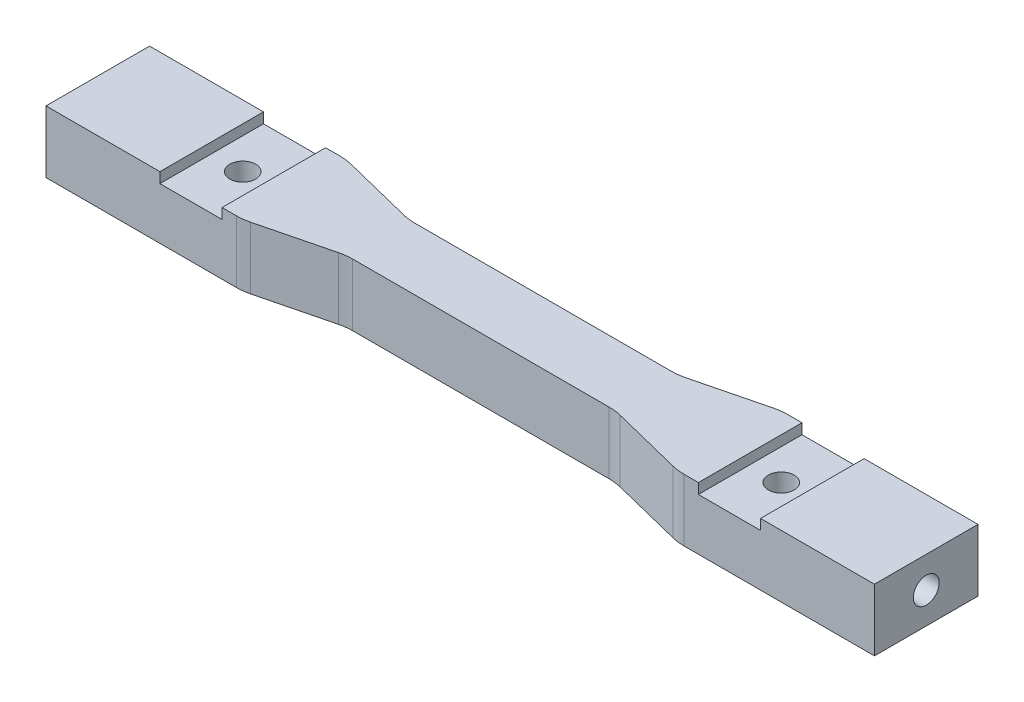
ISO-10303-21;
HEADER;
FILE_DESCRIPTION(('STEP AP214'),'2;1');
FILE_NAME('part.step','',(''),(''),'','','');
FILE_SCHEMA(('AUTOMOTIVE_DESIGN { 1 0 10303 214 1 1 1 1 }'));
ENDSEC;
DATA;
#1=APPLICATION_CONTEXT('core data for automotive mechanical design processes');
#2=APPLICATION_PROTOCOL_DEFINITION('international standard','automotive_design',2000,#1);
#3=PRODUCT_CONTEXT('',#1,'mechanical');
#4=PRODUCT('Part','Part','',(#3));
#5=PRODUCT_RELATED_PRODUCT_CATEGORY('part','',(#4));
#6=PRODUCT_DEFINITION_FORMATION('','',#4);
#7=PRODUCT_DEFINITION_CONTEXT('part definition',#1,'design');
#8=PRODUCT_DEFINITION('design','',#6,#7);
#9=PRODUCT_DEFINITION_SHAPE('','',#8);
#10=(LENGTH_UNIT() NAMED_UNIT(*) SI_UNIT(.MILLI.,.METRE.));
#11=(NAMED_UNIT(*) PLANE_ANGLE_UNIT() SI_UNIT($,.RADIAN.));
#12=(NAMED_UNIT(*) SI_UNIT($,.STERADIAN.) SOLID_ANGLE_UNIT());
#13=UNCERTAINTY_MEASURE_WITH_UNIT(LENGTH_MEASURE(1.E-05),#10,'distance_accuracy_value','');
#14=(GEOMETRIC_REPRESENTATION_CONTEXT(3) GLOBAL_UNCERTAINTY_ASSIGNED_CONTEXT((#13)) GLOBAL_UNIT_ASSIGNED_CONTEXT((#10,
#11,#12)) REPRESENTATION_CONTEXT('',''));
#15=CARTESIAN_POINT('',(0.,0.,0.));
#16=DIRECTION('',(0.,0.,1.));
#17=DIRECTION('',(1.,0.,0.));
#18=AXIS2_PLACEMENT_3D('',#15,#16,#17);
#19=CARTESIAN_POINT('',(0.,6.,0.));
#20=DIRECTION('',(0.,0.,-1.));
#21=DIRECTION('',(-1.,0.,0.));
#22=AXIS2_PLACEMENT_3D('',#19,#20,#21);
#23=PLANE('',#22);
#24=DIRECTION('',(1.,0.,0.));
#25=VECTOR('',#24,1.);
#26=CARTESIAN_POINT('',(0.,0.,0.));
#27=LINE('',#26,#25);
#28=CARTESIAN_POINT('',(0.,0.,0.));
#29=VERTEX_POINT('',#28);
#30=CARTESIAN_POINT('',(18.3844718719117,0.,0.));
#31=VERTEX_POINT('',#30);
#32=EDGE_CURVE('E329',#29,#31,#27,.T.);
#33=ORIENTED_EDGE('',*,*,#32,.T.);
#34=DIRECTION('',(0.,1.,0.));
#35=VECTOR('',#34,1.);
#36=CARTESIAN_POINT('',(18.3844718719117,6.,0.));
#37=LINE('',#36,#35);
#38=CARTESIAN_POINT('',(18.3844718719117,6.,0.));
#39=VERTEX_POINT('',#38);
#40=EDGE_CURVE('E394',#31,#39,#37,.T.);
#41=ORIENTED_EDGE('',*,*,#40,.T.);
#42=DIRECTION('',(1.,0.,0.));
#43=VECTOR('',#42,1.);
#44=CARTESIAN_POINT('',(0.,6.,0.));
#45=LINE('',#44,#43);
#46=CARTESIAN_POINT('',(17.,6.,0.));
#47=VERTEX_POINT('',#46);
#48=EDGE_CURVE('E316',#47,#39,#45,.T.);
#49=ORIENTED_EDGE('',*,*,#48,.F.);
#50=DIRECTION('',(0.,1.,0.));
#51=VECTOR('',#50,1.);
#52=CARTESIAN_POINT('',(17.,5.,0.));
#53=LINE('',#52,#51);
#54=CARTESIAN_POINT('',(17.,5.,0.));
#55=VERTEX_POINT('',#54);
#56=EDGE_CURVE('E303',#55,#47,#53,.T.);
#57=ORIENTED_EDGE('',*,*,#56,.F.);
#58=DIRECTION('',(1.,0.,0.));
#59=VECTOR('',#58,1.);
#60=CARTESIAN_POINT('',(11.,5.,0.));
#61=LINE('',#60,#59);
#62=CARTESIAN_POINT('',(11.,5.,0.));
#63=VERTEX_POINT('',#62);
#64=EDGE_CURVE('E283',#63,#55,#61,.T.);
#65=ORIENTED_EDGE('',*,*,#64,.F.);
#66=DIRECTION('',(0.,1.,0.));
#67=VECTOR('',#66,1.);
#68=CARTESIAN_POINT('',(11.,5.,0.));
#69=LINE('',#68,#67);
#70=CARTESIAN_POINT('',(11.,6.,0.));
#71=VERTEX_POINT('',#70);
#72=EDGE_CURVE('E293',#63,#71,#69,.T.);
#73=ORIENTED_EDGE('',*,*,#72,.T.);
#74=CARTESIAN_POINT('',(0.,6.,0.));
#75=VERTEX_POINT('',#74);
#76=EDGE_CURVE('E312',#75,#71,#45,.T.);
#77=ORIENTED_EDGE('',*,*,#76,.F.);
#78=DIRECTION('',(0.,-1.,0.));
#79=VECTOR('',#78,1.);
#80=CARTESIAN_POINT('',(0.,6.,0.));
#81=LINE('',#80,#79);
#82=EDGE_CURVE('E345',#75,#29,#81,.T.);
#83=ORIENTED_EDGE('',*,*,#82,.T.);
#84=EDGE_LOOP('',(#33,#41,#49,#57,#65,#73,#77,#83));
#85=FACE_BOUND('',#84,.T.);
#86=ADVANCED_FACE('F35',(#85),#23,.F.);
#87=CARTESIAN_POINT('',(0.,6.,-10.));
#88=DIRECTION('',(0.,0.,1.));
#89=DIRECTION('',(1.,0.,0.));
#90=AXIS2_PLACEMENT_3D('',#87,#88,#89);
#91=PLANE('',#90);
#92=DIRECTION('',(-1.,0.,0.));
#93=VECTOR('',#92,1.);
#94=CARTESIAN_POINT('',(0.,0.,-10.));
#95=LINE('',#94,#93);
#96=CARTESIAN_POINT('',(80.,0.,-10.));
#97=VERTEX_POINT('',#96);
#98=CARTESIAN_POINT('',(61.6155281280883,0.,-10.));
#99=VERTEX_POINT('',#98);
#100=EDGE_CURVE('E311',#97,#99,#95,.T.);
#101=ORIENTED_EDGE('',*,*,#100,.T.);
#102=DIRECTION('',(0.,1.,0.));
#103=VECTOR('',#102,1.);
#104=CARTESIAN_POINT('',(61.6155281280883,6.,-10.));
#105=LINE('',#104,#103);
#106=CARTESIAN_POINT('',(61.6155281280883,6.,-10.));
#107=VERTEX_POINT('',#106);
#108=EDGE_CURVE('E397',#99,#107,#105,.T.);
#109=ORIENTED_EDGE('',*,*,#108,.T.);
#110=DIRECTION('',(-1.,0.,0.));
#111=VECTOR('',#110,1.);
#112=CARTESIAN_POINT('',(0.,6.,-10.));
#113=LINE('',#112,#111);
#114=CARTESIAN_POINT('',(63.,6.,-10.));
#115=VERTEX_POINT('',#114);
#116=EDGE_CURVE('E324',#115,#107,#113,.T.);
#117=ORIENTED_EDGE('',*,*,#116,.F.);
#118=DIRECTION('',(0.,1.,0.));
#119=VECTOR('',#118,1.);
#120=CARTESIAN_POINT('',(63.,5.,-10.));
#121=LINE('',#120,#119);
#122=CARTESIAN_POINT('',(63.,5.,-10.));
#123=VERTEX_POINT('',#122);
#124=EDGE_CURVE('E276',#123,#115,#121,.T.);
#125=ORIENTED_EDGE('',*,*,#124,.F.);
#126=DIRECTION('',(-1.,0.,0.));
#127=VECTOR('',#126,1.);
#128=CARTESIAN_POINT('',(69.,5.,-10.));
#129=LINE('',#128,#127);
#130=CARTESIAN_POINT('',(69.,5.,-10.));
#131=VERTEX_POINT('',#130);
#132=EDGE_CURVE('E256',#131,#123,#129,.T.);
#133=ORIENTED_EDGE('',*,*,#132,.F.);
#134=DIRECTION('',(0.,1.,0.));
#135=VECTOR('',#134,1.);
#136=CARTESIAN_POINT('',(69.,5.,-10.));
#137=LINE('',#136,#135);
#138=CARTESIAN_POINT('',(69.,6.,-10.));
#139=VERTEX_POINT('',#138);
#140=EDGE_CURVE('E266',#131,#139,#137,.T.);
#141=ORIENTED_EDGE('',*,*,#140,.T.);
#142=CARTESIAN_POINT('',(80.,6.,-10.));
#143=VERTEX_POINT('',#142);
#144=EDGE_CURVE('E320',#143,#139,#113,.T.);
#145=ORIENTED_EDGE('',*,*,#144,.F.);
#146=DIRECTION('',(0.,-1.,0.));
#147=VECTOR('',#146,1.);
#148=CARTESIAN_POINT('',(80.,6.,-10.));
#149=LINE('',#148,#147);
#150=EDGE_CURVE('E339',#143,#97,#149,.T.);
#151=ORIENTED_EDGE('',*,*,#150,.T.);
#152=EDGE_LOOP('',(#101,#109,#117,#125,#133,#141,#145,#151));
#153=FACE_BOUND('',#152,.T.);
#154=ADVANCED_FACE('F482',(#153),#91,.F.);
#155=CARTESIAN_POINT('',(0.,6.,0.));
#156=DIRECTION('',(0.,-1.,0.));
#157=DIRECTION('',(0.,0.,-1.));
#158=AXIS2_PLACEMENT_3D('',#155,#156,#157);
#159=PLANE('',#158);
#160=ORIENTED_EDGE('',*,*,#144,.T.);
#161=DIRECTION('',(0.,0.,-1.));
#162=VECTOR('',#161,1.);
#163=CARTESIAN_POINT('',(69.,6.,-10.));
#164=LINE('',#163,#162);
#165=CARTESIAN_POINT('',(69.,6.,0.));
#166=VERTEX_POINT('',#165);
#167=EDGE_CURVE('E252',#166,#139,#164,.T.);
#168=ORIENTED_EDGE('',*,*,#167,.F.);
#169=CARTESIAN_POINT('',(80.,6.,0.));
#170=VERTEX_POINT('',#169);
#171=EDGE_CURVE('E310',#166,#170,#45,.T.);
#172=ORIENTED_EDGE('',*,*,#171,.T.);
#173=DIRECTION('',(0.,0.,-1.));
#174=VECTOR('',#173,1.);
#175=CARTESIAN_POINT('',(80.,6.,0.));
#176=LINE('',#175,#174);
#177=EDGE_CURVE('E315',#170,#143,#176,.T.);
#178=ORIENTED_EDGE('',*,*,#177,.T.);
#179=EDGE_LOOP('',(#160,#168,#172,#178));
#180=FACE_BOUND('',#179,.T.);
#181=ADVANCED_FACE('F558',(#180),#159,.F.);
#182=ORIENTED_EDGE('',*,*,#76,.T.);
#183=DIRECTION('',(0.,0.,1.));
#184=VECTOR('',#183,1.);
#185=CARTESIAN_POINT('',(11.,6.,-10.));
#186=LINE('',#185,#184);
#187=CARTESIAN_POINT('',(11.,6.,-10.));
#188=VERTEX_POINT('',#187);
#189=EDGE_CURVE('E272',#188,#71,#186,.T.);
#190=ORIENTED_EDGE('',*,*,#189,.F.);
#191=CARTESIAN_POINT('',(0.,6.,-10.));
#192=VERTEX_POINT('',#191);
#193=EDGE_CURVE('E319',#188,#192,#113,.T.);
#194=ORIENTED_EDGE('',*,*,#193,.T.);
#195=DIRECTION('',(0.,0.,1.));
#196=VECTOR('',#195,1.);
#197=CARTESIAN_POINT('',(0.,6.,0.));
#198=LINE('',#197,#196);
#199=EDGE_CURVE('E307',#192,#75,#198,.T.);
#200=ORIENTED_EDGE('',*,*,#199,.T.);
#201=EDGE_LOOP('',(#182,#190,#194,#200));
#202=FACE_BOUND('',#201,.T.);
#203=ADVANCED_FACE('F545',(#202),#159,.F.);
#204=CARTESIAN_POINT('',(0.,6.,0.));
#205=DIRECTION('',(1.,0.,0.));
#206=DIRECTION('',(0.,0.,-1.));
#207=AXIS2_PLACEMENT_3D('',#204,#205,#206);
#208=PLANE('',#207);
#209=CARTESIAN_POINT('',(0.,3.,-5.));
#210=DIRECTION('',(-1.,0.,0.));
#211=DIRECTION('',(0.,0.,1.));
#212=AXIS2_PLACEMENT_3D('',#209,#210,#211);
#213=CIRCLE('',#212,1.24999999999999);
#214=CARTESIAN_POINT('',(0.,3.,-3.75000000000001));
#215=VERTEX_POINT('',#214);
#216=EDGE_CURVE('E246',#215,#215,#213,.T.);
#217=ORIENTED_EDGE('',*,*,#216,.F.);
#218=EDGE_LOOP('',(#217));
#219=FACE_BOUND('',#218,.T.);
#220=DIRECTION('',(0.,0.,1.));
#221=VECTOR('',#220,1.);
#222=CARTESIAN_POINT('',(0.,0.,0.));
#223=LINE('',#222,#221);
#224=CARTESIAN_POINT('',(0.,0.,-10.));
#225=VERTEX_POINT('',#224);
#226=EDGE_CURVE('E299',#225,#29,#223,.T.);
#227=ORIENTED_EDGE('',*,*,#226,.T.);
#228=ORIENTED_EDGE('',*,*,#82,.F.);
#229=ORIENTED_EDGE('',*,*,#199,.F.);
#230=DIRECTION('',(0.,-1.,0.));
#231=VECTOR('',#230,1.);
#232=CARTESIAN_POINT('',(0.,6.,-10.));
#233=LINE('',#232,#231);
#234=EDGE_CURVE('E323',#192,#225,#233,.T.);
#235=ORIENTED_EDGE('',*,*,#234,.T.);
#236=EDGE_LOOP('',(#227,#228,#229,#235));
#237=FACE_BOUND('',#236,.T.);
#238=ADVANCED_FACE('F531',(#219,#237),#208,.F.);
#239=CARTESIAN_POINT('',(61.6155281280883,6.,0.));
#240=VERTEX_POINT('',#239);
#241=CARTESIAN_POINT('',(63.,6.,0.));
#242=VERTEX_POINT('',#241);
#243=EDGE_CURVE('E317',#240,#242,#45,.T.);
#244=ORIENTED_EDGE('',*,*,#243,.F.);
#245=DIRECTION('',(0.,1.,0.));
#246=VECTOR('',#245,1.);
#247=CARTESIAN_POINT('',(61.6155281280883,6.,0.));
#248=LINE('',#247,#246);
#249=CARTESIAN_POINT('',(61.6155281280883,0.,0.));
#250=VERTEX_POINT('',#249);
#251=EDGE_CURVE('E375',#240,#250,#248,.F.);
#252=ORIENTED_EDGE('',*,*,#251,.T.);
#253=CARTESIAN_POINT('',(80.,0.,0.));
#254=VERTEX_POINT('',#253);
#255=EDGE_CURVE('E328',#250,#254,#27,.T.);
#256=ORIENTED_EDGE('',*,*,#255,.T.);
#257=DIRECTION('',(0.,-1.,0.));
#258=VECTOR('',#257,1.);
#259=CARTESIAN_POINT('',(80.,6.,0.));
#260=LINE('',#259,#258);
#261=EDGE_CURVE('E342',#170,#254,#260,.T.);
#262=ORIENTED_EDGE('',*,*,#261,.F.);
#263=ORIENTED_EDGE('',*,*,#171,.F.);
#264=DIRECTION('',(0.,1.,0.));
#265=VECTOR('',#264,1.);
#266=CARTESIAN_POINT('',(69.,5.,0.));
#267=LINE('',#266,#265);
#268=CARTESIAN_POINT('',(69.,5.,0.));
#269=VERTEX_POINT('',#268);
#270=EDGE_CURVE('E270',#269,#166,#267,.T.);
#271=ORIENTED_EDGE('',*,*,#270,.F.);
#272=DIRECTION('',(1.,0.,0.));
#273=VECTOR('',#272,1.);
#274=CARTESIAN_POINT('',(69.,5.,0.));
#275=LINE('',#274,#273);
#276=CARTESIAN_POINT('',(63.,5.,0.));
#277=VERTEX_POINT('',#276);
#278=EDGE_CURVE('E263',#277,#269,#275,.T.);
#279=ORIENTED_EDGE('',*,*,#278,.F.);
#280=DIRECTION('',(0.,1.,0.));
#281=VECTOR('',#280,1.);
#282=CARTESIAN_POINT('',(63.,5.,0.));
#283=LINE('',#282,#281);
#284=EDGE_CURVE('E273',#277,#242,#283,.T.);
#285=ORIENTED_EDGE('',*,*,#284,.T.);
#286=EDGE_LOOP('',(#244,#252,#256,#262,#263,#271,#279,#285));
#287=FACE_BOUND('',#286,.T.);
#288=ADVANCED_FACE('F560',(#287),#23,.F.);
#289=CARTESIAN_POINT('',(80.,6.,0.));
#290=DIRECTION('',(-1.,0.,0.));
#291=DIRECTION('',(0.,0.,1.));
#292=AXIS2_PLACEMENT_3D('',#289,#290,#291);
#293=PLANE('',#292);
#294=CARTESIAN_POINT('',(80.,3.,-5.));
#295=DIRECTION('',(1.,0.,0.));
#296=DIRECTION('',(0.,0.,-1.));
#297=AXIS2_PLACEMENT_3D('',#294,#295,#296);
#298=CIRCLE('',#297,1.24999999999999);
#299=CARTESIAN_POINT('',(80.,3.,-6.24999999999999));
#300=VERTEX_POINT('',#299);
#301=EDGE_CURVE('E236',#300,#300,#298,.T.);
#302=ORIENTED_EDGE('',*,*,#301,.F.);
#303=EDGE_LOOP('',(#302));
#304=FACE_BOUND('',#303,.T.);
#305=DIRECTION('',(0.,0.,-1.));
#306=VECTOR('',#305,1.);
#307=CARTESIAN_POINT('',(80.,0.,0.));
#308=LINE('',#307,#306);
#309=EDGE_CURVE('E332',#254,#97,#308,.T.);
#310=ORIENTED_EDGE('',*,*,#309,.T.);
#311=ORIENTED_EDGE('',*,*,#150,.F.);
#312=ORIENTED_EDGE('',*,*,#177,.F.);
#313=ORIENTED_EDGE('',*,*,#261,.T.);
#314=EDGE_LOOP('',(#310,#311,#312,#313));
#315=FACE_BOUND('',#314,.T.);
#316=ADVANCED_FACE('F489',(#304,#315),#293,.F.);
#317=CARTESIAN_POINT('',(18.3844718719117,6.,-10.));
#318=VERTEX_POINT('',#317);
#319=CARTESIAN_POINT('',(17.,6.,-10.));
#320=VERTEX_POINT('',#319);
#321=EDGE_CURVE('E325',#318,#320,#113,.T.);
#322=ORIENTED_EDGE('',*,*,#321,.F.);
#323=DIRECTION('',(0.,1.,0.));
#324=VECTOR('',#323,1.);
#325=CARTESIAN_POINT('',(18.3844718719117,6.,-10.));
#326=LINE('',#325,#324);
#327=CARTESIAN_POINT('',(18.3844718719117,0.,-10.));
#328=VERTEX_POINT('',#327);
#329=EDGE_CURVE('E415',#318,#328,#326,.F.);
#330=ORIENTED_EDGE('',*,*,#329,.T.);
#331=EDGE_CURVE('E334',#328,#225,#95,.T.);
#332=ORIENTED_EDGE('',*,*,#331,.T.);
#333=ORIENTED_EDGE('',*,*,#234,.F.);
#334=ORIENTED_EDGE('',*,*,#193,.F.);
#335=DIRECTION('',(0.,1.,0.));
#336=VECTOR('',#335,1.);
#337=CARTESIAN_POINT('',(11.,5.,-10.));
#338=LINE('',#337,#336);
#339=CARTESIAN_POINT('',(11.,5.,-10.));
#340=VERTEX_POINT('',#339);
#341=EDGE_CURVE('E297',#340,#188,#338,.T.);
#342=ORIENTED_EDGE('',*,*,#341,.F.);
#343=DIRECTION('',(-1.,0.,0.));
#344=VECTOR('',#343,1.);
#345=CARTESIAN_POINT('',(11.,5.,-10.));
#346=LINE('',#345,#344);
#347=CARTESIAN_POINT('',(17.,5.,-10.));
#348=VERTEX_POINT('',#347);
#349=EDGE_CURVE('E290',#348,#340,#346,.T.);
#350=ORIENTED_EDGE('',*,*,#349,.F.);
#351=DIRECTION('',(0.,1.,0.));
#352=VECTOR('',#351,1.);
#353=CARTESIAN_POINT('',(17.,5.,-10.));
#354=LINE('',#353,#352);
#355=EDGE_CURVE('E300',#348,#320,#354,.T.);
#356=ORIENTED_EDGE('',*,*,#355,.T.);
#357=EDGE_LOOP('',(#322,#330,#332,#333,#334,#342,#350,#356));
#358=FACE_BOUND('',#357,.T.);
#359=ADVANCED_FACE('F540',(#358),#91,.F.);
#360=DIRECTION('',(-0.970142500145332,0.,-0.242535625036333));
#361=VECTOR('',#360,1.);
#362=CARTESIAN_POINT('',(53.,6.,-2.));
#363=LINE('',#362,#361);
#364=CARTESIAN_POINT('',(60.4028500029066,6.,-0.149287499273339));
#365=VERTEX_POINT('',#364);
#366=CARTESIAN_POINT('',(53.5971499970934,6.,-1.85071250072666));
#367=VERTEX_POINT('',#366);
#368=EDGE_CURVE('E501',#365,#367,#363,.T.);
#369=ORIENTED_EDGE('',*,*,#368,.F.);
#370=CARTESIAN_POINT('',(61.6155281280883,6.,-5.));
#371=DIRECTION('',(0.,-1.,0.));
#372=DIRECTION('',(0.,0.,-1.));
#373=AXIS2_PLACEMENT_3D('',#370,#371,#372);
#374=CIRCLE('',#373,5.);
#375=EDGE_CURVE('E373',#365,#240,#374,.F.);
#376=ORIENTED_EDGE('',*,*,#375,.T.);
#377=ORIENTED_EDGE('',*,*,#243,.T.);
#378=DIRECTION('',(0.,0.,1.));
#379=VECTOR('',#378,1.);
#380=CARTESIAN_POINT('',(63.,6.,-10.));
#381=LINE('',#380,#379);
#382=EDGE_CURVE('E257',#115,#242,#381,.T.);
#383=ORIENTED_EDGE('',*,*,#382,.F.);
#384=ORIENTED_EDGE('',*,*,#116,.T.);
#385=CARTESIAN_POINT('',(61.6155281280883,6.,-5.));
#386=DIRECTION('',(0.,-1.,0.));
#387=DIRECTION('',(0.,0.,-1.));
#388=AXIS2_PLACEMENT_3D('',#385,#386,#387);
#389=CIRCLE('',#388,5.);
#390=CARTESIAN_POINT('',(60.4028500029066,6.,-9.85071250072666));
#391=VERTEX_POINT('',#390);
#392=EDGE_CURVE('E369',#107,#391,#389,.F.);
#393=ORIENTED_EDGE('',*,*,#392,.T.);
#394=DIRECTION('',(0.970142500145332,0.,-0.242535625036333));
#395=VECTOR('',#394,1.);
#396=CARTESIAN_POINT('',(53.,6.,-8.));
#397=LINE('',#396,#395);
#398=CARTESIAN_POINT('',(53.5971499970934,6.,-8.14928749927334));
#399=VERTEX_POINT('',#398);
#400=EDGE_CURVE('E467',#399,#391,#397,.T.);
#401=ORIENTED_EDGE('',*,*,#400,.F.);
#402=CARTESIAN_POINT('',(52.3844718719117,6.,-13.));
#403=DIRECTION('',(0.,-1.,0.));
#404=DIRECTION('',(0.,0.,-1.));
#405=AXIS2_PLACEMENT_3D('',#402,#403,#404);
#406=CIRCLE('',#405,5.);
#407=CARTESIAN_POINT('',(52.3844718719117,6.,-8.));
#408=VERTEX_POINT('',#407);
#409=EDGE_CURVE('E424',#399,#408,#406,.T.);
#410=ORIENTED_EDGE('',*,*,#409,.T.);
#411=DIRECTION('',(1.,0.,0.));
#412=VECTOR('',#411,1.);
#413=CARTESIAN_POINT('',(27.,6.,-8.));
#414=LINE('',#413,#412);
#415=CARTESIAN_POINT('',(27.6155281280883,6.,-8.));
#416=VERTEX_POINT('',#415);
#417=EDGE_CURVE('E435',#416,#408,#414,.T.);
#418=ORIENTED_EDGE('',*,*,#417,.F.);
#419=CARTESIAN_POINT('',(27.6155281280883,6.,-13.));
#420=DIRECTION('',(0.,-1.,0.));
#421=DIRECTION('',(0.,0.,-1.));
#422=AXIS2_PLACEMENT_3D('',#419,#420,#421);
#423=CIRCLE('',#422,5.);
#424=CARTESIAN_POINT('',(26.4028500029066,6.,-8.14928749927334));
#425=VERTEX_POINT('',#424);
#426=EDGE_CURVE('E43',#416,#425,#423,.T.);
#427=ORIENTED_EDGE('',*,*,#426,.T.);
#428=DIRECTION('',(0.970142500145332,0.,0.242535625036333));
#429=VECTOR('',#428,1.);
#430=CARTESIAN_POINT('',(19.,6.,-10.));
#431=LINE('',#430,#429);
#432=CARTESIAN_POINT('',(19.5971499970934,6.,-9.85071250072666));
#433=VERTEX_POINT('',#432);
#434=EDGE_CURVE('E433',#433,#425,#431,.T.);
#435=ORIENTED_EDGE('',*,*,#434,.F.);
#436=CARTESIAN_POINT('',(18.3844718719117,6.,-5.));
#437=DIRECTION('',(0.,-1.,0.));
#438=DIRECTION('',(0.,0.,-1.));
#439=AXIS2_PLACEMENT_3D('',#436,#437,#438);
#440=CIRCLE('',#439,5.);
#441=EDGE_CURVE('E367',#433,#318,#440,.F.);
#442=ORIENTED_EDGE('',*,*,#441,.T.);
#443=ORIENTED_EDGE('',*,*,#321,.T.);
#444=DIRECTION('',(0.,0.,-1.));
#445=VECTOR('',#444,1.);
#446=CARTESIAN_POINT('',(17.,6.,-10.));
#447=LINE('',#446,#445);
#448=EDGE_CURVE('E284',#47,#320,#447,.T.);
#449=ORIENTED_EDGE('',*,*,#448,.F.);
#450=ORIENTED_EDGE('',*,*,#48,.T.);
#451=CARTESIAN_POINT('',(18.3844718719117,6.,-5.));
#452=DIRECTION('',(0.,-1.,0.));
#453=DIRECTION('',(0.,0.,-1.));
#454=AXIS2_PLACEMENT_3D('',#451,#452,#453);
#455=CIRCLE('',#454,5.);
#456=CARTESIAN_POINT('',(19.5971499970934,6.,-0.149287499273341));
#457=VERTEX_POINT('',#456);
#458=EDGE_CURVE('E371',#39,#457,#455,.F.);
#459=ORIENTED_EDGE('',*,*,#458,.T.);
#460=DIRECTION('',(-0.970142500145332,0.,0.242535625036333));
#461=VECTOR('',#460,1.);
#462=CARTESIAN_POINT('',(19.,6.,0.));
#463=LINE('',#462,#461);
#464=CARTESIAN_POINT('',(26.4028500029066,6.,-1.85071250072666));
#465=VERTEX_POINT('',#464);
#466=EDGE_CURVE('E462',#465,#457,#463,.T.);
#467=ORIENTED_EDGE('',*,*,#466,.F.);
#468=CARTESIAN_POINT('',(27.6155281280883,6.,3.));
#469=DIRECTION('',(0.,-1.,0.));
#470=DIRECTION('',(0.,0.,-1.));
#471=AXIS2_PLACEMENT_3D('',#468,#469,#470);
#472=CIRCLE('',#471,5.);
#473=CARTESIAN_POINT('',(27.6155281280883,6.,-2.));
#474=VERTEX_POINT('',#473);
#475=EDGE_CURVE('E420',#465,#474,#472,.T.);
#476=ORIENTED_EDGE('',*,*,#475,.T.);
#477=DIRECTION('',(-1.,0.,0.));
#478=VECTOR('',#477,1.);
#479=CARTESIAN_POINT('',(27.,6.,-2.));
#480=LINE('',#479,#478);
#481=CARTESIAN_POINT('',(52.3844718719117,6.,-2.));
#482=VERTEX_POINT('',#481);
#483=EDGE_CURVE('E505',#482,#474,#480,.T.);
#484=ORIENTED_EDGE('',*,*,#483,.F.);
#485=CARTESIAN_POINT('',(52.3844718719117,6.,3.));
#486=DIRECTION('',(0.,-1.,0.));
#487=DIRECTION('',(0.,0.,-1.));
#488=AXIS2_PLACEMENT_3D('',#485,#486,#487);
#489=CIRCLE('',#488,5.);
#490=EDGE_CURVE('E417',#482,#367,#489,.T.);
#491=ORIENTED_EDGE('',*,*,#490,.T.);
#492=EDGE_LOOP('',(#369,#376,#377,#383,#384,#393,#401,#410,#418,#427,#435,#442,#443,#449,#450,
#459,#467,#476,#484,#491));
#493=FACE_BOUND('',#492,.T.);
#494=ADVANCED_FACE('F432',(#493),#159,.F.);
#495=CARTESIAN_POINT('',(0.,0.,0.));
#496=DIRECTION('',(0.,-1.,0.));
#497=DIRECTION('',(0.,0.,-1.));
#498=AXIS2_PLACEMENT_3D('',#495,#496,#497);
#499=PLANE('',#498);
#500=ORIENTED_EDGE('',*,*,#255,.F.);
#501=CARTESIAN_POINT('',(61.6155281280883,0.,-5.));
#502=DIRECTION('',(0.,-1.,0.));
#503=DIRECTION('',(0.,0.,-1.));
#504=AXIS2_PLACEMENT_3D('',#501,#502,#503);
#505=CIRCLE('',#504,5.);
#506=CARTESIAN_POINT('',(60.4028500029066,0.,-0.149287499273339));
#507=VERTEX_POINT('',#506);
#508=EDGE_CURVE('E383',#250,#507,#505,.T.);
#509=ORIENTED_EDGE('',*,*,#508,.T.);
#510=DIRECTION('',(-0.970142500145332,0.,-0.242535625036333));
#511=VECTOR('',#510,1.);
#512=CARTESIAN_POINT('',(53.,0.,-2.));
#513=LINE('',#512,#511);
#514=CARTESIAN_POINT('',(53.5971499970934,0.,-1.85071250072666));
#515=VERTEX_POINT('',#514);
#516=EDGE_CURVE('E458',#507,#515,#513,.T.);
#517=ORIENTED_EDGE('',*,*,#516,.T.);
#518=CARTESIAN_POINT('',(52.3844718719117,0.,3.));
#519=DIRECTION('',(0.,-1.,0.));
#520=DIRECTION('',(0.,0.,-1.));
#521=AXIS2_PLACEMENT_3D('',#518,#519,#520);
#522=CIRCLE('',#521,5.);
#523=CARTESIAN_POINT('',(52.3844718719117,0.,-2.));
#524=VERTEX_POINT('',#523);
#525=EDGE_CURVE('E57',#515,#524,#522,.F.);
#526=ORIENTED_EDGE('',*,*,#525,.T.);
#527=DIRECTION('',(-1.,0.,0.));
#528=VECTOR('',#527,1.);
#529=CARTESIAN_POINT('',(27.,0.,-2.));
#530=LINE('',#529,#528);
#531=CARTESIAN_POINT('',(27.6155281280883,0.,-2.));
#532=VERTEX_POINT('',#531);
#533=EDGE_CURVE('E510',#524,#532,#530,.T.);
#534=ORIENTED_EDGE('',*,*,#533,.T.);
#535=CARTESIAN_POINT('',(27.6155281280883,0.,3.));
#536=DIRECTION('',(0.,-1.,0.));
#537=DIRECTION('',(0.,0.,-1.));
#538=AXIS2_PLACEMENT_3D('',#535,#536,#537);
#539=CIRCLE('',#538,5.);
#540=CARTESIAN_POINT('',(26.4028500029066,0.,-1.85071250072666));
#541=VERTEX_POINT('',#540);
#542=EDGE_CURVE('E422',#532,#541,#539,.F.);
#543=ORIENTED_EDGE('',*,*,#542,.T.);
#544=DIRECTION('',(-0.970142500145332,0.,0.242535625036333));
#545=VECTOR('',#544,1.);
#546=CARTESIAN_POINT('',(19.,0.,0.));
#547=LINE('',#546,#545);
#548=CARTESIAN_POINT('',(19.5971499970934,0.,-0.149287499273341));
#549=VERTEX_POINT('',#548);
#550=EDGE_CURVE('E506',#541,#549,#547,.T.);
#551=ORIENTED_EDGE('',*,*,#550,.T.);
#552=CARTESIAN_POINT('',(18.3844718719117,0.,-5.));
#553=DIRECTION('',(0.,-1.,0.));
#554=DIRECTION('',(0.,0.,-1.));
#555=AXIS2_PLACEMENT_3D('',#552,#553,#554);
#556=CIRCLE('',#555,5.);
#557=EDGE_CURVE('E381',#549,#31,#556,.T.);
#558=ORIENTED_EDGE('',*,*,#557,.T.);
#559=ORIENTED_EDGE('',*,*,#32,.F.);
#560=ORIENTED_EDGE('',*,*,#226,.F.);
#561=ORIENTED_EDGE('',*,*,#331,.F.);
#562=CARTESIAN_POINT('',(18.3844718719117,0.,-5.));
#563=DIRECTION('',(0.,-1.,0.));
#564=DIRECTION('',(0.,0.,-1.));
#565=AXIS2_PLACEMENT_3D('',#562,#563,#564);
#566=CIRCLE('',#565,5.);
#567=CARTESIAN_POINT('',(19.5971499970934,0.,-9.85071250072666));
#568=VERTEX_POINT('',#567);
#569=EDGE_CURVE('E377',#328,#568,#566,.T.);
#570=ORIENTED_EDGE('',*,*,#569,.T.);
#571=DIRECTION('',(0.970142500145332,0.,0.242535625036333));
#572=VECTOR('',#571,1.);
#573=CARTESIAN_POINT('',(19.,0.,-10.));
#574=LINE('',#573,#572);
#575=CARTESIAN_POINT('',(26.4028500029066,0.,-8.14928749927334));
#576=VERTEX_POINT('',#575);
#577=EDGE_CURVE('E242',#568,#576,#574,.T.);
#578=ORIENTED_EDGE('',*,*,#577,.T.);
#579=CARTESIAN_POINT('',(27.6155281280883,0.,-13.));
#580=DIRECTION('',(0.,-1.,0.));
#581=DIRECTION('',(0.,0.,-1.));
#582=AXIS2_PLACEMENT_3D('',#579,#580,#581);
#583=CIRCLE('',#582,5.);
#584=CARTESIAN_POINT('',(27.6155281280883,0.,-8.));
#585=VERTEX_POINT('',#584);
#586=EDGE_CURVE('E11',#576,#585,#583,.F.);
#587=ORIENTED_EDGE('',*,*,#586,.T.);
#588=DIRECTION('',(1.,0.,0.));
#589=VECTOR('',#588,1.);
#590=CARTESIAN_POINT('',(27.,0.,-8.));
#591=LINE('',#590,#589);
#592=CARTESIAN_POINT('',(52.3844718719117,0.,-8.));
#593=VERTEX_POINT('',#592);
#594=EDGE_CURVE('E453',#585,#593,#591,.T.);
#595=ORIENTED_EDGE('',*,*,#594,.T.);
#596=CARTESIAN_POINT('',(52.3844718719117,0.,-13.));
#597=DIRECTION('',(0.,-1.,0.));
#598=DIRECTION('',(0.,0.,-1.));
#599=AXIS2_PLACEMENT_3D('',#596,#597,#598);
#600=CIRCLE('',#599,5.);
#601=CARTESIAN_POINT('',(53.5971499970934,0.,-8.14928749927334));
#602=VERTEX_POINT('',#601);
#603=EDGE_CURVE('E426',#593,#602,#600,.F.);
#604=ORIENTED_EDGE('',*,*,#603,.T.);
#605=DIRECTION('',(0.970142500145332,0.,-0.242535625036333));
#606=VECTOR('',#605,1.);
#607=CARTESIAN_POINT('',(53.,0.,-8.));
#608=LINE('',#607,#606);
#609=CARTESIAN_POINT('',(60.4028500029066,0.,-9.85071250072666));
#610=VERTEX_POINT('',#609);
#611=EDGE_CURVE('E444',#602,#610,#608,.T.);
#612=ORIENTED_EDGE('',*,*,#611,.T.);
#613=CARTESIAN_POINT('',(61.6155281280883,0.,-5.));
#614=DIRECTION('',(0.,-1.,0.));
#615=DIRECTION('',(0.,0.,-1.));
#616=AXIS2_PLACEMENT_3D('',#613,#614,#615);
#617=CIRCLE('',#616,5.);
#618=EDGE_CURVE('E379',#610,#99,#617,.T.);
#619=ORIENTED_EDGE('',*,*,#618,.T.);
#620=ORIENTED_EDGE('',*,*,#100,.F.);
#621=ORIENTED_EDGE('',*,*,#309,.F.);
#622=EDGE_LOOP('',(#500,#509,#517,#526,#534,#543,#551,#558,#559,#560,#561,#570,#578,#587,#595,
#604,#612,#619,#620,#621));
#623=FACE_BOUND('',#622,.T.);
#624=CARTESIAN_POINT('',(66.,0.,-5.));
#625=DIRECTION('',(0.,-1.,0.));
#626=DIRECTION('',(0.,0.,-1.));
#627=AXIS2_PLACEMENT_3D('',#624,#625,#626);
#628=CIRCLE('',#627,2.75);
#629=CARTESIAN_POINT('',(66.,0.,-7.75));
#630=VERTEX_POINT('',#629);
#631=EDGE_CURVE('E356',#630,#630,#628,.F.);
#632=ORIENTED_EDGE('',*,*,#631,.T.);
#633=EDGE_LOOP('',(#632));
#634=FACE_BOUND('',#633,.T.);
#635=CARTESIAN_POINT('',(14.,0.,-5.));
#636=DIRECTION('',(0.,-1.,0.));
#637=DIRECTION('',(0.,0.,-1.));
#638=AXIS2_PLACEMENT_3D('',#635,#636,#637);
#639=CIRCLE('',#638,2.75);
#640=CARTESIAN_POINT('',(14.,0.,-7.75));
#641=VERTEX_POINT('',#640);
#642=EDGE_CURVE('E353',#641,#641,#639,.F.);
#643=ORIENTED_EDGE('',*,*,#642,.T.);
#644=EDGE_LOOP('',(#643));
#645=FACE_BOUND('',#644,.T.);
#646=ADVANCED_FACE('F451',(#623,#634,#645),#499,.T.);
#647=CARTESIAN_POINT('',(11.,5.,-10.));
#648=DIRECTION('',(-1.,0.,0.));
#649=DIRECTION('',(0.,0.,1.));
#650=AXIS2_PLACEMENT_3D('',#647,#648,#649);
#651=PLANE('',#650);
#652=ORIENTED_EDGE('',*,*,#189,.T.);
#653=ORIENTED_EDGE('',*,*,#72,.F.);
#654=DIRECTION('',(0.,0.,1.));
#655=VECTOR('',#654,1.);
#656=CARTESIAN_POINT('',(11.,5.,-10.));
#657=LINE('',#656,#655);
#658=EDGE_CURVE('E280',#340,#63,#657,.T.);
#659=ORIENTED_EDGE('',*,*,#658,.F.);
#660=ORIENTED_EDGE('',*,*,#341,.T.);
#661=EDGE_LOOP('',(#652,#653,#659,#660));
#662=FACE_BOUND('',#661,.T.);
#663=ADVANCED_FACE('F548',(#662),#651,.F.);
#664=CARTESIAN_POINT('',(17.,5.,-10.));
#665=DIRECTION('',(1.,0.,0.));
#666=DIRECTION('',(0.,0.,-1.));
#667=AXIS2_PLACEMENT_3D('',#664,#665,#666);
#668=PLANE('',#667);
#669=ORIENTED_EDGE('',*,*,#448,.T.);
#670=ORIENTED_EDGE('',*,*,#355,.F.);
#671=DIRECTION('',(0.,0.,-1.));
#672=VECTOR('',#671,1.);
#673=CARTESIAN_POINT('',(17.,5.,-10.));
#674=LINE('',#673,#672);
#675=EDGE_CURVE('E287',#55,#348,#674,.T.);
#676=ORIENTED_EDGE('',*,*,#675,.F.);
#677=ORIENTED_EDGE('',*,*,#56,.T.);
#678=EDGE_LOOP('',(#669,#670,#676,#677));
#679=FACE_BOUND('',#678,.T.);
#680=ADVANCED_FACE('F554',(#679),#668,.F.);
#681=CARTESIAN_POINT('',(0.,5.,0.));
#682=DIRECTION('',(0.,1.,0.));
#683=DIRECTION('',(0.,0.,1.));
#684=AXIS2_PLACEMENT_3D('',#681,#682,#683);
#685=PLANE('',#684);
#686=CARTESIAN_POINT('',(14.,5.,-5.));
#687=DIRECTION('',(0.,1.,0.));
#688=DIRECTION('',(0.,0.,1.));
#689=AXIS2_PLACEMENT_3D('',#686,#687,#688);
#690=CIRCLE('',#689,1.24999999999999);
#691=CARTESIAN_POINT('',(14.,5.,-3.75000000000001));
#692=VERTEX_POINT('',#691);
#693=EDGE_CURVE('E239',#692,#692,#690,.T.);
#694=ORIENTED_EDGE('',*,*,#693,.F.);
#695=EDGE_LOOP('',(#694));
#696=FACE_BOUND('',#695,.T.);
#697=ORIENTED_EDGE('',*,*,#658,.T.);
#698=ORIENTED_EDGE('',*,*,#64,.T.);
#699=ORIENTED_EDGE('',*,*,#675,.T.);
#700=ORIENTED_EDGE('',*,*,#349,.T.);
#701=EDGE_LOOP('',(#697,#698,#699,#700));
#702=FACE_BOUND('',#701,.T.);
#703=ADVANCED_FACE('F551',(#696,#702),#685,.T.);
#704=CARTESIAN_POINT('',(69.,5.,-10.));
#705=DIRECTION('',(1.,0.,0.));
#706=DIRECTION('',(0.,0.,-1.));
#707=AXIS2_PLACEMENT_3D('',#704,#705,#706);
#708=PLANE('',#707);
#709=ORIENTED_EDGE('',*,*,#167,.T.);
#710=ORIENTED_EDGE('',*,*,#140,.F.);
#711=DIRECTION('',(0.,0.,-1.));
#712=VECTOR('',#711,1.);
#713=CARTESIAN_POINT('',(69.,5.,-10.));
#714=LINE('',#713,#712);
#715=EDGE_CURVE('E253',#269,#131,#714,.T.);
#716=ORIENTED_EDGE('',*,*,#715,.F.);
#717=ORIENTED_EDGE('',*,*,#270,.T.);
#718=EDGE_LOOP('',(#709,#710,#716,#717));
#719=FACE_BOUND('',#718,.T.);
#720=ADVANCED_FACE('F641',(#719),#708,.F.);
#721=CARTESIAN_POINT('',(63.,5.,-10.));
#722=DIRECTION('',(-1.,0.,0.));
#723=DIRECTION('',(0.,0.,1.));
#724=AXIS2_PLACEMENT_3D('',#721,#722,#723);
#725=PLANE('',#724);
#726=ORIENTED_EDGE('',*,*,#382,.T.);
#727=ORIENTED_EDGE('',*,*,#284,.F.);
#728=DIRECTION('',(0.,0.,1.));
#729=VECTOR('',#728,1.);
#730=CARTESIAN_POINT('',(63.,5.,-10.));
#731=LINE('',#730,#729);
#732=EDGE_CURVE('E260',#123,#277,#731,.T.);
#733=ORIENTED_EDGE('',*,*,#732,.F.);
#734=ORIENTED_EDGE('',*,*,#124,.T.);
#735=EDGE_LOOP('',(#726,#727,#733,#734));
#736=FACE_BOUND('',#735,.T.);
#737=ADVANCED_FACE('F649',(#736),#725,.F.);
#738=CARTESIAN_POINT('',(0.,5.,0.));
#739=DIRECTION('',(0.,-1.,0.));
#740=DIRECTION('',(0.,0.,-1.));
#741=AXIS2_PLACEMENT_3D('',#738,#739,#740);
#742=PLANE('',#741);
#743=CARTESIAN_POINT('',(66.,5.,-5.));
#744=DIRECTION('',(0.,-1.,0.));
#745=DIRECTION('',(0.,0.,-1.));
#746=AXIS2_PLACEMENT_3D('',#743,#744,#745);
#747=CIRCLE('',#746,1.24999999999999);
#748=CARTESIAN_POINT('',(66.,5.,-6.24999999999999));
#749=VERTEX_POINT('',#748);
#750=EDGE_CURVE('E235',#749,#749,#747,.T.);
#751=ORIENTED_EDGE('',*,*,#750,.T.);
#752=EDGE_LOOP('',(#751));
#753=FACE_BOUND('',#752,.T.);
#754=ORIENTED_EDGE('',*,*,#715,.T.);
#755=ORIENTED_EDGE('',*,*,#132,.T.);
#756=ORIENTED_EDGE('',*,*,#732,.T.);
#757=ORIENTED_EDGE('',*,*,#278,.T.);
#758=EDGE_LOOP('',(#754,#755,#756,#757));
#759=FACE_BOUND('',#758,.T.);
#760=ADVANCED_FACE('F656',(#753,#759),#742,.F.);
#761=CARTESIAN_POINT('',(9.99999999999999,3.,-5.));
#762=DIRECTION('',(-1.,0.,0.));
#763=DIRECTION('',(0.,0.,1.));
#764=AXIS2_PLACEMENT_3D('',#761,#762,#763);
#765=CONICAL_SURFACE('',#764,1.24999999999999,1.02974425867665);
#766=CARTESIAN_POINT('',(10.7510757737844,3.,-5.));
#767=VERTEX_POINT('',#766);
#768=VERTEX_LOOP('',#767);
#769=FACE_BOUND('',#768,.T.);
#770=CARTESIAN_POINT('',(9.99999999999999,3.,-5.));
#771=DIRECTION('',(-1.,0.,0.));
#772=DIRECTION('',(0.,0.,1.));
#773=AXIS2_PLACEMENT_3D('',#770,#771,#772);
#774=CIRCLE('',#773,1.24999999999999);
#775=CARTESIAN_POINT('',(9.99999999999999,3.,-3.75000000000001));
#776=VERTEX_POINT('',#775);
#777=EDGE_CURVE('E249',#776,#776,#774,.T.);
#778=ORIENTED_EDGE('',*,*,#777,.T.);
#779=EDGE_LOOP('',(#778));
#780=FACE_BOUND('',#779,.T.);
#781=ADVANCED_FACE('F663',(#769,#780),#765,.F.);
#782=CARTESIAN_POINT('',(0.,3.,-5.));
#783=DIRECTION('',(-1.,0.,0.));
#784=DIRECTION('',(0.,0.,1.));
#785=AXIS2_PLACEMENT_3D('',#782,#783,#784);
#786=CYLINDRICAL_SURFACE('',#785,1.24999999999999);
#787=ORIENTED_EDGE('',*,*,#777,.F.);
#788=EDGE_LOOP('',(#787));
#789=FACE_BOUND('',#788,.T.);
#790=ORIENTED_EDGE('',*,*,#216,.T.);
#791=EDGE_LOOP('',(#790));
#792=FACE_BOUND('',#791,.T.);
#793=ADVANCED_FACE('F671',(#789,#792),#786,.F.);
#794=CARTESIAN_POINT('',(14.,0.,-5.));
#795=DIRECTION('',(0.,-1.,0.));
#796=DIRECTION('',(0.,0.,-1.));
#797=AXIS2_PLACEMENT_3D('',#794,#795,#796);
#798=CYLINDRICAL_SURFACE('',#797,1.24999999999999);
#799=CARTESIAN_POINT('',(14.,1.5,-5.));
#800=DIRECTION('',(0.,-1.,0.));
#801=DIRECTION('',(0.,0.,-1.));
#802=AXIS2_PLACEMENT_3D('',#799,#800,#801);
#803=CIRCLE('',#802,1.24999999999999);
#804=CARTESIAN_POINT('',(14.,1.5,-6.24999999999999));
#805=VERTEX_POINT('',#804);
#806=EDGE_CURVE('E359',#805,#805,#803,.T.);
#807=ORIENTED_EDGE('',*,*,#806,.T.);
#808=EDGE_LOOP('',(#807));
#809=FACE_BOUND('',#808,.T.);
#810=ORIENTED_EDGE('',*,*,#693,.T.);
#811=EDGE_LOOP('',(#810));
#812=FACE_BOUND('',#811,.T.);
#813=ADVANCED_FACE('F679',(#809,#812),#798,.F.);
#814=CARTESIAN_POINT('',(66.,0.,-5.));
#815=DIRECTION('',(0.,-1.,0.));
#816=DIRECTION('',(0.,0.,-1.));
#817=AXIS2_PLACEMENT_3D('',#814,#815,#816);
#818=CYLINDRICAL_SURFACE('',#817,1.24999999999999);
#819=CARTESIAN_POINT('',(66.,1.50000000000001,-5.));
#820=DIRECTION('',(0.,-1.,0.));
#821=DIRECTION('',(0.,0.,-1.));
#822=AXIS2_PLACEMENT_3D('',#819,#820,#821);
#823=CIRCLE('',#822,1.24999999999999);
#824=CARTESIAN_POINT('',(66.,1.50000000000001,-6.24999999999999));
#825=VERTEX_POINT('',#824);
#826=EDGE_CURVE('E348',#825,#825,#823,.T.);
#827=ORIENTED_EDGE('',*,*,#826,.T.);
#828=EDGE_LOOP('',(#827));
#829=FACE_BOUND('',#828,.T.);
#830=ORIENTED_EDGE('',*,*,#750,.F.);
#831=EDGE_LOOP('',(#830));
#832=FACE_BOUND('',#831,.T.);
#833=ADVANCED_FACE('F229',(#829,#832),#818,.F.);
#834=CARTESIAN_POINT('',(70.,3.,-5.));
#835=DIRECTION('',(1.,0.,0.));
#836=DIRECTION('',(0.,0.,-1.));
#837=AXIS2_PLACEMENT_3D('',#834,#835,#836);
#838=CONICAL_SURFACE('',#837,1.24999999999999,1.02974425867665);
#839=CARTESIAN_POINT('',(69.2489242262156,3.,-5.));
#840=VERTEX_POINT('',#839);
#841=VERTEX_LOOP('',#840);
#842=FACE_BOUND('',#841,.T.);
#843=CARTESIAN_POINT('',(70.,3.,-5.));
#844=DIRECTION('',(1.,0.,0.));
#845=DIRECTION('',(0.,0.,-1.));
#846=AXIS2_PLACEMENT_3D('',#843,#844,#845);
#847=CIRCLE('',#846,1.24999999999999);
#848=CARTESIAN_POINT('',(70.,3.,-6.24999999999999));
#849=VERTEX_POINT('',#848);
#850=EDGE_CURVE('E233',#849,#849,#847,.T.);
#851=ORIENTED_EDGE('',*,*,#850,.T.);
#852=EDGE_LOOP('',(#851));
#853=FACE_BOUND('',#852,.T.);
#854=ADVANCED_FACE('F225',(#842,#853),#838,.F.);
#855=CARTESIAN_POINT('',(80.,3.,-5.));
#856=DIRECTION('',(1.,0.,0.));
#857=DIRECTION('',(0.,0.,-1.));
#858=AXIS2_PLACEMENT_3D('',#855,#856,#857);
#859=CYLINDRICAL_SURFACE('',#858,1.24999999999999);
#860=ORIENTED_EDGE('',*,*,#850,.F.);
#861=EDGE_LOOP('',(#860));
#862=FACE_BOUND('',#861,.T.);
#863=ORIENTED_EDGE('',*,*,#301,.T.);
#864=EDGE_LOOP('',(#863));
#865=FACE_BOUND('',#864,.T.);
#866=ADVANCED_FACE('F228',(#862,#865),#859,.F.);
#867=CARTESIAN_POINT('',(66.,1.50000000000001,-5.));
#868=DIRECTION('',(0.,-1.,0.));
#869=DIRECTION('',(0.,0.,-1.));
#870=AXIS2_PLACEMENT_3D('',#867,#868,#869);
#871=CONICAL_SURFACE('',#870,1.24999999999999,0.785398163397449);
#872=ORIENTED_EDGE('',*,*,#631,.F.);
#873=EDGE_LOOP('',(#872));
#874=FACE_BOUND('',#873,.T.);
#875=ORIENTED_EDGE('',*,*,#826,.F.);
#876=EDGE_LOOP('',(#875));
#877=FACE_BOUND('',#876,.T.);
#878=ADVANCED_FACE('F706',(#874,#877),#871,.F.);
#879=CARTESIAN_POINT('',(14.,1.5,-5.));
#880=DIRECTION('',(0.,-1.,0.));
#881=DIRECTION('',(0.,0.,-1.));
#882=AXIS2_PLACEMENT_3D('',#879,#880,#881);
#883=CONICAL_SURFACE('',#882,1.24999999999999,0.785398163397449);
#884=ORIENTED_EDGE('',*,*,#642,.F.);
#885=EDGE_LOOP('',(#884));
#886=FACE_BOUND('',#885,.T.);
#887=ORIENTED_EDGE('',*,*,#806,.F.);
#888=EDGE_LOOP('',(#887));
#889=FACE_BOUND('',#888,.T.);
#890=ADVANCED_FACE('F712',(#886,#889),#883,.F.);
#891=CARTESIAN_POINT('',(53.,-0.00100000000000013,-8.));
#892=DIRECTION('',(0.242535625036333,0.,0.970142500145332));
#893=DIRECTION('',(0.970142500145332,0.,-0.242535625036333));
#894=AXIS2_PLACEMENT_3D('',#891,#892,#893);
#895=PLANE('',#894);
#896=ORIENTED_EDGE('',*,*,#400,.T.);
#897=DIRECTION('',(0.,1.,0.));
#898=VECTOR('',#897,1.);
#899=CARTESIAN_POINT('',(60.4028500029066,-0.00100000000000013,-9.85071250072666));
#900=LINE('',#899,#898);
#901=EDGE_CURVE('E403',#391,#610,#900,.F.);
#902=ORIENTED_EDGE('',*,*,#901,.T.);
#903=ORIENTED_EDGE('',*,*,#611,.F.);
#904=DIRECTION('',(0.,1.,0.));
#905=VECTOR('',#904,1.);
#906=CARTESIAN_POINT('',(53.5971499970934,6.,-8.14928749927334));
#907=LINE('',#906,#905);
#908=EDGE_CURVE('E400',#602,#399,#907,.T.);
#909=ORIENTED_EDGE('',*,*,#908,.T.);
#910=EDGE_LOOP('',(#896,#902,#903,#909));
#911=FACE_BOUND('',#910,.T.);
#912=ADVANCED_FACE('F472',(#911),#895,.F.);
#913=CARTESIAN_POINT('',(27.,-0.00100000000000013,-8.));
#914=DIRECTION('',(0.,0.,1.));
#915=DIRECTION('',(1.,0.,0.));
#916=AXIS2_PLACEMENT_3D('',#913,#914,#915);
#917=PLANE('',#916);
#918=ORIENTED_EDGE('',*,*,#417,.T.);
#919=DIRECTION('',(0.,1.,0.));
#920=VECTOR('',#919,1.);
#921=CARTESIAN_POINT('',(52.3844718719117,0.,-8.));
#922=LINE('',#921,#920);
#923=EDGE_CURVE('E408',#408,#593,#922,.F.);
#924=ORIENTED_EDGE('',*,*,#923,.T.);
#925=ORIENTED_EDGE('',*,*,#594,.F.);
#926=DIRECTION('',(0.,1.,0.));
#927=VECTOR('',#926,1.);
#928=CARTESIAN_POINT('',(27.6155281280883,6.,-8.));
#929=LINE('',#928,#927);
#930=EDGE_CURVE('E405',#585,#416,#929,.T.);
#931=ORIENTED_EDGE('',*,*,#930,.T.);
#932=EDGE_LOOP('',(#918,#924,#925,#931));
#933=FACE_BOUND('',#932,.T.);
#934=ADVANCED_FACE('F456',(#933),#917,.F.);
#935=CARTESIAN_POINT('',(19.,-0.00100000000000013,-10.));
#936=DIRECTION('',(-0.242535625036333,0.,0.970142500145332));
#937=DIRECTION('',(0.970142500145332,0.,0.242535625036333));
#938=AXIS2_PLACEMENT_3D('',#935,#936,#937);
#939=PLANE('',#938);
#940=ORIENTED_EDGE('',*,*,#434,.T.);
#941=DIRECTION('',(0.,1.,0.));
#942=VECTOR('',#941,1.);
#943=CARTESIAN_POINT('',(26.4028500029066,0.,-8.14928749927334));
#944=LINE('',#943,#942);
#945=EDGE_CURVE('E413',#425,#576,#944,.F.);
#946=ORIENTED_EDGE('',*,*,#945,.T.);
#947=ORIENTED_EDGE('',*,*,#577,.F.);
#948=DIRECTION('',(0.,1.,0.));
#949=VECTOR('',#948,1.);
#950=CARTESIAN_POINT('',(19.5971499970934,-0.00100000000000013,-9.85071250072666));
#951=LINE('',#950,#949);
#952=EDGE_CURVE('E410',#568,#433,#951,.T.);
#953=ORIENTED_EDGE('',*,*,#952,.T.);
#954=EDGE_LOOP('',(#940,#946,#947,#953));
#955=FACE_BOUND('',#954,.T.);
#956=ADVANCED_FACE('F440',(#955),#939,.F.);
#957=CARTESIAN_POINT('',(19.,-0.00100000000000013,0.));
#958=DIRECTION('',(-0.242535625036333,0.,-0.970142500145332));
#959=DIRECTION('',(-0.970142500145332,0.,0.242535625036333));
#960=AXIS2_PLACEMENT_3D('',#957,#958,#959);
#961=PLANE('',#960);
#962=ORIENTED_EDGE('',*,*,#550,.F.);
#963=DIRECTION('',(0.,1.,0.));
#964=VECTOR('',#963,1.);
#965=CARTESIAN_POINT('',(26.4028500029066,6.,-1.85071250072666));
#966=LINE('',#965,#964);
#967=EDGE_CURVE('E391',#541,#465,#966,.T.);
#968=ORIENTED_EDGE('',*,*,#967,.T.);
#969=ORIENTED_EDGE('',*,*,#466,.T.);
#970=DIRECTION('',(0.,1.,0.));
#971=VECTOR('',#970,1.);
#972=CARTESIAN_POINT('',(19.5971499970934,-0.00100000000000013,-0.149287499273341));
#973=LINE('',#972,#971);
#974=EDGE_CURVE('E389',#457,#549,#973,.F.);
#975=ORIENTED_EDGE('',*,*,#974,.T.);
#976=EDGE_LOOP('',(#962,#968,#969,#975));
#977=FACE_BOUND('',#976,.T.);
#978=ADVANCED_FACE('F518',(#977),#961,.F.);
#979=CARTESIAN_POINT('',(27.,-0.00100000000000013,-2.));
#980=DIRECTION('',(0.,0.,-1.));
#981=DIRECTION('',(-1.,0.,0.));
#982=AXIS2_PLACEMENT_3D('',#979,#980,#981);
#983=PLANE('',#982);
#984=ORIENTED_EDGE('',*,*,#533,.F.);
#985=DIRECTION('',(0.,1.,0.));
#986=VECTOR('',#985,1.);
#987=CARTESIAN_POINT('',(52.3844718719117,6.,-2.));
#988=LINE('',#987,#986);
#989=EDGE_CURVE('E386',#524,#482,#988,.T.);
#990=ORIENTED_EDGE('',*,*,#989,.T.);
#991=ORIENTED_EDGE('',*,*,#483,.T.);
#992=DIRECTION('',(0.,1.,0.));
#993=VECTOR('',#992,1.);
#994=CARTESIAN_POINT('',(27.6155281280883,0.,-2.));
#995=LINE('',#994,#993);
#996=EDGE_CURVE('E50',#474,#532,#995,.F.);
#997=ORIENTED_EDGE('',*,*,#996,.T.);
#998=EDGE_LOOP('',(#984,#990,#991,#997));
#999=FACE_BOUND('',#998,.T.);
#1000=ADVANCED_FACE('F751',(#999),#983,.F.);
#1001=CARTESIAN_POINT('',(53.,-0.00100000000000013,-2.));
#1002=DIRECTION('',(0.242535625036333,0.,-0.970142500145332));
#1003=DIRECTION('',(-0.970142500145332,0.,-0.242535625036333));
#1004=AXIS2_PLACEMENT_3D('',#1001,#1002,#1003);
#1005=PLANE('',#1004);
#1006=ORIENTED_EDGE('',*,*,#516,.F.);
#1007=DIRECTION('',(0.,1.,0.));
#1008=VECTOR('',#1007,1.);
#1009=CARTESIAN_POINT('',(60.4028500029066,-0.00100000000000013,-0.149287499273339));
#1010=LINE('',#1009,#1008);
#1011=EDGE_CURVE('E364',#507,#365,#1010,.T.);
#1012=ORIENTED_EDGE('',*,*,#1011,.T.);
#1013=ORIENTED_EDGE('',*,*,#368,.T.);
#1014=DIRECTION('',(0.,1.,0.));
#1015=VECTOR('',#1014,1.);
#1016=CARTESIAN_POINT('',(53.5971499970934,0.,-1.85071250072666));
#1017=LINE('',#1016,#1015);
#1018=EDGE_CURVE('E362',#367,#515,#1017,.F.);
#1019=ORIENTED_EDGE('',*,*,#1018,.T.);
#1020=EDGE_LOOP('',(#1006,#1012,#1013,#1019));
#1021=FACE_BOUND('',#1020,.T.);
#1022=ADVANCED_FACE('F500',(#1021),#1005,.F.);
#1023=CARTESIAN_POINT('',(61.6155281280883,-0.00100000000000013,-5.));
#1024=DIRECTION('',(0.,1.,0.));
#1025=DIRECTION('',(0.,0.,1.));
#1026=AXIS2_PLACEMENT_3D('',#1023,#1024,#1025);
#1027=CYLINDRICAL_SURFACE('',#1026,5.);
#1028=ORIENTED_EDGE('',*,*,#508,.F.);
#1029=ORIENTED_EDGE('',*,*,#251,.F.);
#1030=ORIENTED_EDGE('',*,*,#375,.F.);
#1031=ORIENTED_EDGE('',*,*,#1011,.F.);
#1032=EDGE_LOOP('',(#1028,#1029,#1030,#1031));
#1033=FACE_BOUND('',#1032,.T.);
#1034=ADVANCED_FACE('F497',(#1033),#1027,.T.);
#1035=CARTESIAN_POINT('',(52.3844718719117,-0.00100000000000013,3.));
#1036=DIRECTION('',(0.,-1.,0.));
#1037=DIRECTION('',(0.,0.,-1.));
#1038=AXIS2_PLACEMENT_3D('',#1035,#1036,#1037);
#1039=CYLINDRICAL_SURFACE('',#1038,5.);
#1040=ORIENTED_EDGE('',*,*,#525,.F.);
#1041=ORIENTED_EDGE('',*,*,#1018,.F.);
#1042=ORIENTED_EDGE('',*,*,#490,.F.);
#1043=ORIENTED_EDGE('',*,*,#989,.F.);
#1044=EDGE_LOOP('',(#1040,#1041,#1042,#1043));
#1045=FACE_BOUND('',#1044,.T.);
#1046=ADVANCED_FACE('F770',(#1045),#1039,.F.);
#1047=CARTESIAN_POINT('',(27.6155281280883,-0.00100000000000013,3.));
#1048=DIRECTION('',(0.,-1.,0.));
#1049=DIRECTION('',(0.,0.,-1.));
#1050=AXIS2_PLACEMENT_3D('',#1047,#1048,#1049);
#1051=CYLINDRICAL_SURFACE('',#1050,5.);
#1052=ORIENTED_EDGE('',*,*,#542,.F.);
#1053=ORIENTED_EDGE('',*,*,#996,.F.);
#1054=ORIENTED_EDGE('',*,*,#475,.F.);
#1055=ORIENTED_EDGE('',*,*,#967,.F.);
#1056=EDGE_LOOP('',(#1052,#1053,#1054,#1055));
#1057=FACE_BOUND('',#1056,.T.);
#1058=ADVANCED_FACE('F777',(#1057),#1051,.F.);
#1059=CARTESIAN_POINT('',(18.3844718719117,6.,-5.));
#1060=DIRECTION('',(0.,1.,0.));
#1061=DIRECTION('',(0.,0.,1.));
#1062=AXIS2_PLACEMENT_3D('',#1059,#1060,#1061);
#1063=CYLINDRICAL_SURFACE('',#1062,5.);
#1064=ORIENTED_EDGE('',*,*,#557,.F.);
#1065=ORIENTED_EDGE('',*,*,#974,.F.);
#1066=ORIENTED_EDGE('',*,*,#458,.F.);
#1067=ORIENTED_EDGE('',*,*,#40,.F.);
#1068=EDGE_LOOP('',(#1064,#1065,#1066,#1067));
#1069=FACE_BOUND('',#1068,.T.);
#1070=ADVANCED_FACE('F522',(#1069),#1063,.T.);
#1071=CARTESIAN_POINT('',(61.6155281280883,6.,-5.));
#1072=DIRECTION('',(0.,1.,0.));
#1073=DIRECTION('',(0.,0.,1.));
#1074=AXIS2_PLACEMENT_3D('',#1071,#1072,#1073);
#1075=CYLINDRICAL_SURFACE('',#1074,5.);
#1076=ORIENTED_EDGE('',*,*,#618,.F.);
#1077=ORIENTED_EDGE('',*,*,#901,.F.);
#1078=ORIENTED_EDGE('',*,*,#392,.F.);
#1079=ORIENTED_EDGE('',*,*,#108,.F.);
#1080=EDGE_LOOP('',(#1076,#1077,#1078,#1079));
#1081=FACE_BOUND('',#1080,.T.);
#1082=ADVANCED_FACE('F477',(#1081),#1075,.T.);
#1083=CARTESIAN_POINT('',(52.3844718719117,-0.00100000000000013,-13.));
#1084=DIRECTION('',(0.,-1.,0.));
#1085=DIRECTION('',(0.,0.,-1.));
#1086=AXIS2_PLACEMENT_3D('',#1083,#1084,#1085);
#1087=CYLINDRICAL_SURFACE('',#1086,5.);
#1088=ORIENTED_EDGE('',*,*,#603,.F.);
#1089=ORIENTED_EDGE('',*,*,#923,.F.);
#1090=ORIENTED_EDGE('',*,*,#409,.F.);
#1091=ORIENTED_EDGE('',*,*,#908,.F.);
#1092=EDGE_LOOP('',(#1088,#1089,#1090,#1091));
#1093=FACE_BOUND('',#1092,.T.);
#1094=ADVANCED_FACE('F798',(#1093),#1087,.F.);
#1095=CARTESIAN_POINT('',(27.6155281280883,-0.00100000000000013,-13.));
#1096=DIRECTION('',(0.,-1.,0.));
#1097=DIRECTION('',(0.,0.,-1.));
#1098=AXIS2_PLACEMENT_3D('',#1095,#1096,#1097);
#1099=CYLINDRICAL_SURFACE('',#1098,5.);
#1100=ORIENTED_EDGE('',*,*,#586,.F.);
#1101=ORIENTED_EDGE('',*,*,#945,.F.);
#1102=ORIENTED_EDGE('',*,*,#426,.F.);
#1103=ORIENTED_EDGE('',*,*,#930,.F.);
#1104=EDGE_LOOP('',(#1100,#1101,#1102,#1103));
#1105=FACE_BOUND('',#1104,.T.);
#1106=ADVANCED_FACE('F447',(#1105),#1099,.F.);
#1107=CARTESIAN_POINT('',(18.3844718719117,-0.00100000000000013,-5.));
#1108=DIRECTION('',(0.,1.,0.));
#1109=DIRECTION('',(0.,0.,1.));
#1110=AXIS2_PLACEMENT_3D('',#1107,#1108,#1109);
#1111=CYLINDRICAL_SURFACE('',#1110,5.);
#1112=ORIENTED_EDGE('',*,*,#569,.F.);
#1113=ORIENTED_EDGE('',*,*,#329,.F.);
#1114=ORIENTED_EDGE('',*,*,#441,.F.);
#1115=ORIENTED_EDGE('',*,*,#952,.F.);
#1116=EDGE_LOOP('',(#1112,#1113,#1114,#1115));
#1117=FACE_BOUND('',#1116,.T.);
#1118=ADVANCED_FACE('F37',(#1117),#1111,.T.);
#1119=CLOSED_SHELL('',(#86,#154,#181,#203,#238,#288,#316,#359,#494,#646,#663,#680,#703,#720,
#737,#760,#781,#793,#813,#833,#854,#866,#878,#890,#912,#934,#956,#978,#1000,#1022,#1034,#1046,
#1058,#1070,#1082,#1094,#1106,#1118));
#1120=MANIFOLD_SOLID_BREP('B2',#1119);
#1121=ADVANCED_BREP_SHAPE_REPRESENTATION('',(#18,#1120),#14);
#1122=SHAPE_DEFINITION_REPRESENTATION(#9,#1121);
ENDSEC;
END-ISO-10303-21;
